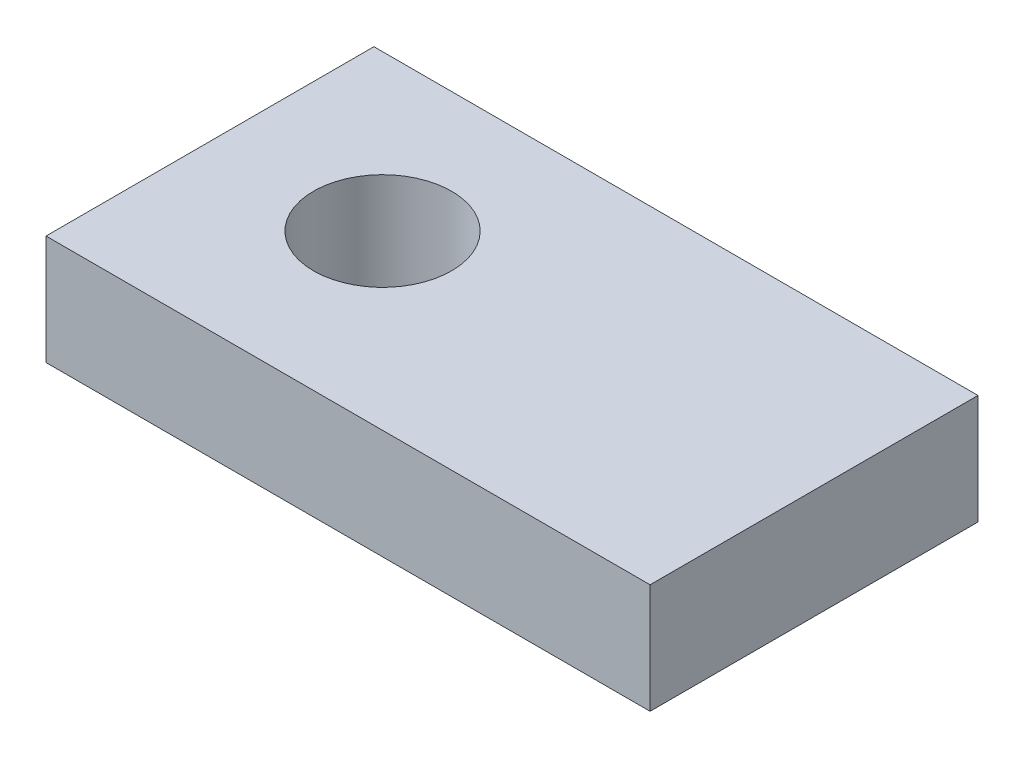
ISO-10303-21;
HEADER;
FILE_DESCRIPTION(('STEP AP214'),'2;1');
FILE_NAME('part.step','',(''),(''),'','','');
FILE_SCHEMA(('AUTOMOTIVE_DESIGN { 1 0 10303 214 1 1 1 1 }'));
ENDSEC;
DATA;
#1=APPLICATION_CONTEXT('core data for automotive mechanical design processes');
#2=APPLICATION_PROTOCOL_DEFINITION('international standard','automotive_design',2000,#1);
#3=PRODUCT_CONTEXT('',#1,'mechanical');
#4=PRODUCT('Part','Part','',(#3));
#5=PRODUCT_RELATED_PRODUCT_CATEGORY('part','',(#4));
#6=PRODUCT_DEFINITION_FORMATION('','',#4);
#7=PRODUCT_DEFINITION_CONTEXT('part definition',#1,'design');
#8=PRODUCT_DEFINITION('design','',#6,#7);
#9=PRODUCT_DEFINITION_SHAPE('','',#8);
#10=(LENGTH_UNIT() NAMED_UNIT(*) SI_UNIT(.MILLI.,.METRE.));
#11=(NAMED_UNIT(*) PLANE_ANGLE_UNIT() SI_UNIT($,.RADIAN.));
#12=(NAMED_UNIT(*) SI_UNIT($,.STERADIAN.) SOLID_ANGLE_UNIT());
#13=UNCERTAINTY_MEASURE_WITH_UNIT(LENGTH_MEASURE(1.E-05),#10,'distance_accuracy_value','');
#14=(GEOMETRIC_REPRESENTATION_CONTEXT(3) GLOBAL_UNCERTAINTY_ASSIGNED_CONTEXT((#13)) GLOBAL_UNIT_ASSIGNED_CONTEXT((#10,
#11,#12)) REPRESENTATION_CONTEXT('',''));
#15=CARTESIAN_POINT('',(0.,0.,0.));
#16=DIRECTION('',(0.,0.,1.));
#17=DIRECTION('',(1.,0.,0.));
#18=AXIS2_PLACEMENT_3D('',#15,#16,#17);
#19=CARTESIAN_POINT('',(0.,6.35,0.));
#20=DIRECTION('',(0.,-1.,0.));
#21=DIRECTION('',(0.,0.,-1.));
#22=AXIS2_PLACEMENT_3D('',#19,#20,#21);
#23=PLANE('',#22);
#24=DIRECTION('',(0.,0.,-1.));
#25=VECTOR('',#24,1.);
#26=CARTESIAN_POINT('',(17.5,6.35,9.5));
#27=LINE('',#26,#25);
#28=CARTESIAN_POINT('',(17.5,6.35,9.5));
#29=VERTEX_POINT('',#28);
#30=CARTESIAN_POINT('',(17.5,6.35,-9.5));
#31=VERTEX_POINT('',#30);
#32=EDGE_CURVE('E92',#29,#31,#27,.T.);
#33=ORIENTED_EDGE('',*,*,#32,.T.);
#34=DIRECTION('',(-1.,0.,0.));
#35=VECTOR('',#34,1.);
#36=CARTESIAN_POINT('',(-17.5,6.35,-9.5));
#37=LINE('',#36,#35);
#38=CARTESIAN_POINT('',(-17.5,6.35,-9.5));
#39=VERTEX_POINT('',#38);
#40=EDGE_CURVE('E87',#31,#39,#37,.T.);
#41=ORIENTED_EDGE('',*,*,#40,.T.);
#42=DIRECTION('',(0.,0.,1.));
#43=VECTOR('',#42,1.);
#44=CARTESIAN_POINT('',(-17.5,6.35,9.5));
#45=LINE('',#44,#43);
#46=CARTESIAN_POINT('',(-17.5,6.35,9.5));
#47=VERTEX_POINT('',#46);
#48=EDGE_CURVE('E90',#39,#47,#45,.T.);
#49=ORIENTED_EDGE('',*,*,#48,.T.);
#50=DIRECTION('',(1.,0.,0.));
#51=VECTOR('',#50,1.);
#52=CARTESIAN_POINT('',(-17.5,6.35,9.5));
#53=LINE('',#52,#51);
#54=EDGE_CURVE('E57',#47,#29,#53,.T.);
#55=ORIENTED_EDGE('',*,*,#54,.T.);
#56=EDGE_LOOP('',(#33,#41,#49,#55));
#57=FACE_BOUND('',#56,.T.);
#58=CARTESIAN_POINT('',(-8.,6.35,-0.5));
#59=DIRECTION('',(0.,1.,0.));
#60=DIRECTION('',(0.,0.,1.));
#61=AXIS2_PLACEMENT_3D('',#58,#59,#60);
#62=CIRCLE('',#61,4.);
#63=CARTESIAN_POINT('',(-8.,6.35,3.5));
#64=VERTEX_POINT('',#63);
#65=EDGE_CURVE('E112',#64,#64,#62,.T.);
#66=ORIENTED_EDGE('',*,*,#65,.F.);
#67=EDGE_LOOP('',(#66));
#68=FACE_BOUND('',#67,.T.);
#69=ADVANCED_FACE('F39',(#57,#68),#23,.F.);
#70=CARTESIAN_POINT('',(0.,0.,0.));
#71=DIRECTION('',(0.,-1.,0.));
#72=DIRECTION('',(0.,0.,-1.));
#73=AXIS2_PLACEMENT_3D('',#70,#71,#72);
#74=PLANE('',#73);
#75=DIRECTION('',(0.,0.,-1.));
#76=VECTOR('',#75,1.);
#77=CARTESIAN_POINT('',(17.5,0.,9.5));
#78=LINE('',#77,#76);
#79=CARTESIAN_POINT('',(17.5,0.,9.5));
#80=VERTEX_POINT('',#79);
#81=CARTESIAN_POINT('',(17.5,0.,-9.5));
#82=VERTEX_POINT('',#81);
#83=EDGE_CURVE('E108',#80,#82,#78,.T.);
#84=ORIENTED_EDGE('',*,*,#83,.F.);
#85=DIRECTION('',(1.,0.,0.));
#86=VECTOR('',#85,1.);
#87=CARTESIAN_POINT('',(-17.5,0.,9.5));
#88=LINE('',#87,#86);
#89=CARTESIAN_POINT('',(-17.5,0.,9.5));
#90=VERTEX_POINT('',#89);
#91=EDGE_CURVE('E80',#90,#80,#88,.T.);
#92=ORIENTED_EDGE('',*,*,#91,.F.);
#93=DIRECTION('',(0.,0.,1.));
#94=VECTOR('',#93,1.);
#95=CARTESIAN_POINT('',(-17.5,0.,9.5));
#96=LINE('',#95,#94);
#97=CARTESIAN_POINT('',(-17.5,0.,-9.5));
#98=VERTEX_POINT('',#97);
#99=EDGE_CURVE('E74',#98,#90,#96,.T.);
#100=ORIENTED_EDGE('',*,*,#99,.F.);
#101=DIRECTION('',(-1.,0.,0.));
#102=VECTOR('',#101,1.);
#103=CARTESIAN_POINT('',(-17.5,0.,-9.5));
#104=LINE('',#103,#102);
#105=EDGE_CURVE('E97',#82,#98,#104,.T.);
#106=ORIENTED_EDGE('',*,*,#105,.F.);
#107=EDGE_LOOP('',(#84,#92,#100,#106));
#108=FACE_BOUND('',#107,.T.);
#109=CARTESIAN_POINT('',(-8.,0.,-0.5));
#110=DIRECTION('',(0.,1.,0.));
#111=DIRECTION('',(0.,0.,1.));
#112=AXIS2_PLACEMENT_3D('',#109,#110,#111);
#113=CIRCLE('',#112,4.);
#114=CARTESIAN_POINT('',(-8.,0.,3.5));
#115=VERTEX_POINT('',#114);
#116=EDGE_CURVE('E130',#115,#115,#113,.T.);
#117=ORIENTED_EDGE('',*,*,#116,.T.);
#118=EDGE_LOOP('',(#117));
#119=FACE_BOUND('',#118,.T.);
#120=ADVANCED_FACE('F125',(#108,#119),#74,.T.);
#121=CARTESIAN_POINT('',(17.5,6.35,9.5));
#122=DIRECTION('',(-1.,0.,0.));
#123=DIRECTION('',(0.,0.,1.));
#124=AXIS2_PLACEMENT_3D('',#121,#122,#123);
#125=PLANE('',#124);
#126=ORIENTED_EDGE('',*,*,#83,.T.);
#127=DIRECTION('',(0.,-1.,0.));
#128=VECTOR('',#127,1.);
#129=CARTESIAN_POINT('',(17.5,6.35,-9.5));
#130=LINE('',#129,#128);
#131=EDGE_CURVE('E11',#31,#82,#130,.T.);
#132=ORIENTED_EDGE('',*,*,#131,.F.);
#133=ORIENTED_EDGE('',*,*,#32,.F.);
#134=DIRECTION('',(0.,-1.,0.));
#135=VECTOR('',#134,1.);
#136=CARTESIAN_POINT('',(17.5,6.35,9.5));
#137=LINE('',#136,#135);
#138=EDGE_CURVE('E104',#29,#80,#137,.T.);
#139=ORIENTED_EDGE('',*,*,#138,.T.);
#140=EDGE_LOOP('',(#126,#132,#133,#139));
#141=FACE_BOUND('',#140,.T.);
#142=ADVANCED_FACE('F41',(#141),#125,.F.);
#143=CARTESIAN_POINT('',(-17.5,6.35,-9.5));
#144=DIRECTION('',(0.,0.,1.));
#145=DIRECTION('',(1.,0.,0.));
#146=AXIS2_PLACEMENT_3D('',#143,#144,#145);
#147=PLANE('',#146);
#148=ORIENTED_EDGE('',*,*,#105,.T.);
#149=DIRECTION('',(0.,-1.,0.));
#150=VECTOR('',#149,1.);
#151=CARTESIAN_POINT('',(-17.5,6.35,-9.5));
#152=LINE('',#151,#150);
#153=EDGE_CURVE('E49',#39,#98,#152,.T.);
#154=ORIENTED_EDGE('',*,*,#153,.F.);
#155=ORIENTED_EDGE('',*,*,#40,.F.);
#156=ORIENTED_EDGE('',*,*,#131,.T.);
#157=EDGE_LOOP('',(#148,#154,#155,#156));
#158=FACE_BOUND('',#157,.T.);
#159=ADVANCED_FACE('F96',(#158),#147,.F.);
#160=CARTESIAN_POINT('',(-17.5,6.35,9.5));
#161=DIRECTION('',(1.,0.,0.));
#162=DIRECTION('',(0.,0.,-1.));
#163=AXIS2_PLACEMENT_3D('',#160,#161,#162);
#164=PLANE('',#163);
#165=ORIENTED_EDGE('',*,*,#99,.T.);
#166=DIRECTION('',(0.,-1.,0.));
#167=VECTOR('',#166,1.);
#168=CARTESIAN_POINT('',(-17.5,6.35,9.5));
#169=LINE('',#168,#167);
#170=EDGE_CURVE('E99',#47,#90,#169,.T.);
#171=ORIENTED_EDGE('',*,*,#170,.F.);
#172=ORIENTED_EDGE('',*,*,#48,.F.);
#173=ORIENTED_EDGE('',*,*,#153,.T.);
#174=EDGE_LOOP('',(#165,#171,#172,#173));
#175=FACE_BOUND('',#174,.T.);
#176=ADVANCED_FACE('F100',(#175),#164,.F.);
#177=CARTESIAN_POINT('',(-17.5,6.35,9.5));
#178=DIRECTION('',(0.,0.,-1.));
#179=DIRECTION('',(-1.,0.,0.));
#180=AXIS2_PLACEMENT_3D('',#177,#178,#179);
#181=PLANE('',#180);
#182=ORIENTED_EDGE('',*,*,#91,.T.);
#183=ORIENTED_EDGE('',*,*,#138,.F.);
#184=ORIENTED_EDGE('',*,*,#54,.F.);
#185=ORIENTED_EDGE('',*,*,#170,.T.);
#186=EDGE_LOOP('',(#182,#183,#184,#185));
#187=FACE_BOUND('',#186,.T.);
#188=ADVANCED_FACE('F122',(#187),#181,.F.);
#189=CARTESIAN_POINT('',(-8.,6.35,-0.5));
#190=DIRECTION('',(0.,-1.,0.));
#191=DIRECTION('',(0.,0.,-1.));
#192=AXIS2_PLACEMENT_3D('',#189,#190,#191);
#193=CYLINDRICAL_SURFACE('',#192,4.);
#194=ORIENTED_EDGE('',*,*,#65,.T.);
#195=EDGE_LOOP('',(#194));
#196=FACE_BOUND('',#195,.T.);
#197=ORIENTED_EDGE('',*,*,#116,.F.);
#198=EDGE_LOOP('',(#197));
#199=FACE_BOUND('',#198,.T.);
#200=ADVANCED_FACE('F138',(#196,#199),#193,.F.);
#201=CLOSED_SHELL('',(#69,#120,#142,#159,#176,#188,#200));
#202=MANIFOLD_SOLID_BREP('B2',#201);
#203=ADVANCED_BREP_SHAPE_REPRESENTATION('',(#18,#202),#14);
#204=SHAPE_DEFINITION_REPRESENTATION(#9,#203);
ENDSEC;
END-ISO-10303-21;
